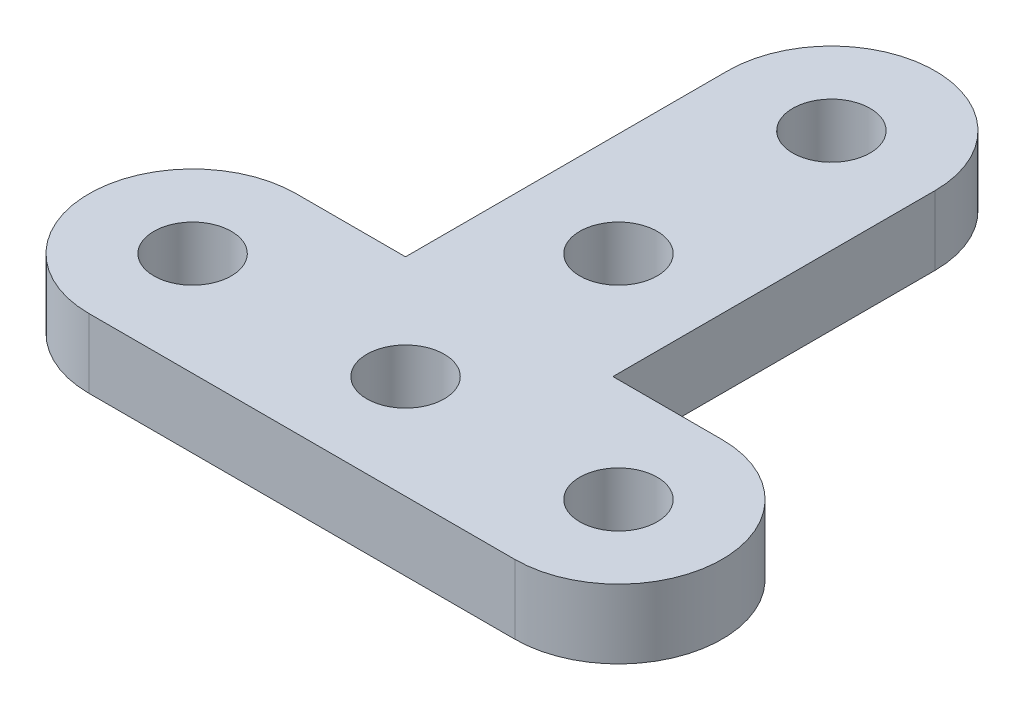
ISO-10303-21;
HEADER;
FILE_DESCRIPTION(('STEP AP214'),'2;1');
FILE_NAME('part.step','',(''),(''),'','','');
FILE_SCHEMA(('AUTOMOTIVE_DESIGN { 1 0 10303 214 1 1 1 1 }'));
ENDSEC;
DATA;
#1=APPLICATION_CONTEXT('core data for automotive mechanical design processes');
#2=APPLICATION_PROTOCOL_DEFINITION('international standard','automotive_design',2000,#1);
#3=PRODUCT_CONTEXT('',#1,'mechanical');
#4=PRODUCT('Part','Part','',(#3));
#5=PRODUCT_RELATED_PRODUCT_CATEGORY('part','',(#4));
#6=PRODUCT_DEFINITION_FORMATION('','',#4);
#7=PRODUCT_DEFINITION_CONTEXT('part definition',#1,'design');
#8=PRODUCT_DEFINITION('design','',#6,#7);
#9=PRODUCT_DEFINITION_SHAPE('','',#8);
#10=(LENGTH_UNIT() NAMED_UNIT(*) SI_UNIT(.MILLI.,.METRE.));
#11=(NAMED_UNIT(*) PLANE_ANGLE_UNIT() SI_UNIT($,.RADIAN.));
#12=(NAMED_UNIT(*) SI_UNIT($,.STERADIAN.) SOLID_ANGLE_UNIT());
#13=UNCERTAINTY_MEASURE_WITH_UNIT(LENGTH_MEASURE(1.E-05),#10,'distance_accuracy_value','');
#14=(GEOMETRIC_REPRESENTATION_CONTEXT(3) GLOBAL_UNCERTAINTY_ASSIGNED_CONTEXT((#13)) GLOBAL_UNIT_ASSIGNED_CONTEXT((#10,
#11,#12)) REPRESENTATION_CONTEXT('',''));
#15=CARTESIAN_POINT('',(0.,0.,0.));
#16=DIRECTION('',(0.,0.,1.));
#17=DIRECTION('',(1.,0.,0.));
#18=AXIS2_PLACEMENT_3D('',#15,#16,#17);
#19=CARTESIAN_POINT('',(9.779,0.,-4.7625));
#20=DIRECTION('',(0.,0.,-1.));
#21=DIRECTION('',(-1.,0.,0.));
#22=AXIS2_PLACEMENT_3D('',#19,#20,#21);
#23=PLANE('',#22);
#24=DIRECTION('',(-1.,0.,0.));
#25=VECTOR('',#24,1.);
#26=CARTESIAN_POINT('',(9.779,3.175,-4.7625));
#27=LINE('',#26,#25);
#28=CARTESIAN_POINT('',(9.779,3.175,-4.7625));
#29=VERTEX_POINT('',#28);
#30=CARTESIAN_POINT('',(4.7625,3.175,-4.7625));
#31=VERTEX_POINT('',#30);
#32=EDGE_CURVE('E129',#29,#31,#27,.T.);
#33=ORIENTED_EDGE('',*,*,#32,.F.);
#34=DIRECTION('',(0.,1.,0.));
#35=VECTOR('',#34,1.);
#36=CARTESIAN_POINT('',(9.779,0.,-4.7625));
#37=LINE('',#36,#35);
#38=CARTESIAN_POINT('',(9.779,0.,-4.7625));
#39=VERTEX_POINT('',#38);
#40=EDGE_CURVE('E11',#39,#29,#37,.T.);
#41=ORIENTED_EDGE('',*,*,#40,.F.);
#42=DIRECTION('',(-1.,0.,0.));
#43=VECTOR('',#42,1.);
#44=CARTESIAN_POINT('',(9.779,0.,-4.7625));
#45=LINE('',#44,#43);
#46=CARTESIAN_POINT('',(4.7625,0.,-4.7625));
#47=VERTEX_POINT('',#46);
#48=EDGE_CURVE('E150',#39,#47,#45,.T.);
#49=ORIENTED_EDGE('',*,*,#48,.T.);
#50=DIRECTION('',(0.,1.,0.));
#51=VECTOR('',#50,1.);
#52=CARTESIAN_POINT('',(4.7625,0.,-4.7625));
#53=LINE('',#52,#51);
#54=EDGE_CURVE('E35',#47,#31,#53,.T.);
#55=ORIENTED_EDGE('',*,*,#54,.T.);
#56=EDGE_LOOP('',(#33,#41,#49,#55));
#57=FACE_BOUND('',#56,.T.);
#58=ADVANCED_FACE('F32',(#57),#23,.T.);
#59=CARTESIAN_POINT('',(9.779,0.,0.));
#60=DIRECTION('',(0.,1.,0.));
#61=DIRECTION('',(0.,0.,1.));
#62=AXIS2_PLACEMENT_3D('',#59,#60,#61);
#63=CYLINDRICAL_SURFACE('',#62,4.7625);
#64=CARTESIAN_POINT('',(9.779,3.175,0.));
#65=DIRECTION('',(0.,1.,0.));
#66=DIRECTION('',(0.,0.,1.));
#67=AXIS2_PLACEMENT_3D('',#64,#65,#66);
#68=CIRCLE('',#67,4.7625);
#69=CARTESIAN_POINT('',(9.779,3.175,4.7625));
#70=VERTEX_POINT('',#69);
#71=EDGE_CURVE('E148',#70,#29,#68,.T.);
#72=ORIENTED_EDGE('',*,*,#71,.F.);
#73=DIRECTION('',(0.,1.,0.));
#74=VECTOR('',#73,1.);
#75=CARTESIAN_POINT('',(9.779,0.,4.7625));
#76=LINE('',#75,#74);
#77=CARTESIAN_POINT('',(9.779,0.,4.7625));
#78=VERTEX_POINT('',#77);
#79=EDGE_CURVE('E41',#78,#70,#76,.T.);
#80=ORIENTED_EDGE('',*,*,#79,.F.);
#81=CARTESIAN_POINT('',(9.779,0.,0.));
#82=DIRECTION('',(0.,1.,0.));
#83=DIRECTION('',(0.,0.,1.));
#84=AXIS2_PLACEMENT_3D('',#81,#82,#83);
#85=CIRCLE('',#84,4.7625);
#86=EDGE_CURVE('E119',#78,#39,#85,.T.);
#87=ORIENTED_EDGE('',*,*,#86,.T.);
#88=ORIENTED_EDGE('',*,*,#40,.T.);
#89=EDGE_LOOP('',(#72,#80,#87,#88));
#90=FACE_BOUND('',#89,.T.);
#91=ADVANCED_FACE('F162',(#90),#63,.T.);
#92=CARTESIAN_POINT('',(-9.779,0.,4.7625));
#93=DIRECTION('',(0.,0.,1.));
#94=DIRECTION('',(1.,0.,0.));
#95=AXIS2_PLACEMENT_3D('',#92,#93,#94);
#96=PLANE('',#95);
#97=DIRECTION('',(1.,0.,0.));
#98=VECTOR('',#97,1.);
#99=CARTESIAN_POINT('',(-9.779,3.175,4.7625));
#100=LINE('',#99,#98);
#101=CARTESIAN_POINT('',(-9.779,3.175,4.7625));
#102=VERTEX_POINT('',#101);
#103=EDGE_CURVE('E106',#102,#70,#100,.T.);
#104=ORIENTED_EDGE('',*,*,#103,.F.);
#105=DIRECTION('',(0.,1.,0.));
#106=VECTOR('',#105,1.);
#107=CARTESIAN_POINT('',(-9.779,0.,4.7625));
#108=LINE('',#107,#106);
#109=CARTESIAN_POINT('',(-9.779,0.,4.7625));
#110=VERTEX_POINT('',#109);
#111=EDGE_CURVE('E101',#110,#102,#108,.T.);
#112=ORIENTED_EDGE('',*,*,#111,.F.);
#113=DIRECTION('',(1.,0.,0.));
#114=VECTOR('',#113,1.);
#115=CARTESIAN_POINT('',(-9.779,0.,4.7625));
#116=LINE('',#115,#114);
#117=EDGE_CURVE('E104',#110,#78,#116,.T.);
#118=ORIENTED_EDGE('',*,*,#117,.T.);
#119=ORIENTED_EDGE('',*,*,#79,.T.);
#120=EDGE_LOOP('',(#104,#112,#118,#119));
#121=FACE_BOUND('',#120,.T.);
#122=ADVANCED_FACE('F103',(#121),#96,.T.);
#123=CARTESIAN_POINT('',(-9.779,0.,0.));
#124=DIRECTION('',(0.,1.,0.));
#125=DIRECTION('',(0.,0.,1.));
#126=AXIS2_PLACEMENT_3D('',#123,#124,#125);
#127=CYLINDRICAL_SURFACE('',#126,4.7625);
#128=CARTESIAN_POINT('',(-9.779,3.175,0.));
#129=DIRECTION('',(0.,1.,0.));
#130=DIRECTION('',(0.,0.,1.));
#131=AXIS2_PLACEMENT_3D('',#128,#129,#130);
#132=CIRCLE('',#131,4.7625);
#133=CARTESIAN_POINT('',(-9.779,3.175,-4.7625));
#134=VERTEX_POINT('',#133);
#135=EDGE_CURVE('E145',#134,#102,#132,.T.);
#136=ORIENTED_EDGE('',*,*,#135,.F.);
#137=DIRECTION('',(0.,1.,0.));
#138=VECTOR('',#137,1.);
#139=CARTESIAN_POINT('',(-9.779,0.,-4.7625));
#140=LINE('',#139,#138);
#141=CARTESIAN_POINT('',(-9.779,0.,-4.7625));
#142=VERTEX_POINT('',#141);
#143=EDGE_CURVE('E111',#142,#134,#140,.T.);
#144=ORIENTED_EDGE('',*,*,#143,.F.);
#145=CARTESIAN_POINT('',(-9.779,0.,0.));
#146=DIRECTION('',(0.,1.,0.));
#147=DIRECTION('',(0.,0.,1.));
#148=AXIS2_PLACEMENT_3D('',#145,#146,#147);
#149=CIRCLE('',#148,4.7625);
#150=EDGE_CURVE('E117',#142,#110,#149,.T.);
#151=ORIENTED_EDGE('',*,*,#150,.T.);
#152=ORIENTED_EDGE('',*,*,#111,.T.);
#153=EDGE_LOOP('',(#136,#144,#151,#152));
#154=FACE_BOUND('',#153,.T.);
#155=ADVANCED_FACE('F121',(#154),#127,.T.);
#156=CARTESIAN_POINT('',(-4.7625,0.,-4.7625));
#157=DIRECTION('',(0.,0.,-1.));
#158=DIRECTION('',(-1.,0.,0.));
#159=AXIS2_PLACEMENT_3D('',#156,#157,#158);
#160=PLANE('',#159);
#161=DIRECTION('',(-1.,0.,0.));
#162=VECTOR('',#161,1.);
#163=CARTESIAN_POINT('',(-4.7625,3.175,-4.7625));
#164=LINE('',#163,#162);
#165=CARTESIAN_POINT('',(-4.7625,3.175,-4.7625));
#166=VERTEX_POINT('',#165);
#167=EDGE_CURVE('E142',#166,#134,#164,.T.);
#168=ORIENTED_EDGE('',*,*,#167,.F.);
#169=DIRECTION('',(0.,1.,0.));
#170=VECTOR('',#169,1.);
#171=CARTESIAN_POINT('',(-4.7625,0.,-4.7625));
#172=LINE('',#171,#170);
#173=CARTESIAN_POINT('',(-4.7625,0.,-4.7625));
#174=VERTEX_POINT('',#173);
#175=EDGE_CURVE('E154',#174,#166,#172,.T.);
#176=ORIENTED_EDGE('',*,*,#175,.F.);
#177=DIRECTION('',(-1.,0.,0.));
#178=VECTOR('',#177,1.);
#179=CARTESIAN_POINT('',(-4.7625,0.,-4.7625));
#180=LINE('',#179,#178);
#181=EDGE_CURVE('E122',#174,#142,#180,.T.);
#182=ORIENTED_EDGE('',*,*,#181,.T.);
#183=ORIENTED_EDGE('',*,*,#143,.T.);
#184=EDGE_LOOP('',(#168,#176,#182,#183));
#185=FACE_BOUND('',#184,.T.);
#186=ADVANCED_FACE('F175',(#185),#160,.T.);
#187=CARTESIAN_POINT('',(-4.7625,0.,-19.558));
#188=DIRECTION('',(-1.,0.,0.));
#189=DIRECTION('',(0.,0.,1.));
#190=AXIS2_PLACEMENT_3D('',#187,#188,#189);
#191=PLANE('',#190);
#192=DIRECTION('',(0.,0.,1.));
#193=VECTOR('',#192,1.);
#194=CARTESIAN_POINT('',(-4.7625,3.175,-19.558));
#195=LINE('',#194,#193);
#196=CARTESIAN_POINT('',(-4.7625,3.175,-19.558));
#197=VERTEX_POINT('',#196);
#198=EDGE_CURVE('E139',#197,#166,#195,.T.);
#199=ORIENTED_EDGE('',*,*,#198,.F.);
#200=DIRECTION('',(0.,1.,0.));
#201=VECTOR('',#200,1.);
#202=CARTESIAN_POINT('',(-4.7625,0.,-19.558));
#203=LINE('',#202,#201);
#204=CARTESIAN_POINT('',(-4.7625,0.,-19.558));
#205=VERTEX_POINT('',#204);
#206=EDGE_CURVE('E156',#205,#197,#203,.T.);
#207=ORIENTED_EDGE('',*,*,#206,.F.);
#208=DIRECTION('',(0.,0.,1.));
#209=VECTOR('',#208,1.);
#210=CARTESIAN_POINT('',(-4.7625,0.,-19.558));
#211=LINE('',#210,#209);
#212=EDGE_CURVE('E124',#205,#174,#211,.T.);
#213=ORIENTED_EDGE('',*,*,#212,.T.);
#214=ORIENTED_EDGE('',*,*,#175,.T.);
#215=EDGE_LOOP('',(#199,#207,#213,#214));
#216=FACE_BOUND('',#215,.T.);
#217=ADVANCED_FACE('F178',(#216),#191,.T.);
#218=CARTESIAN_POINT('',(0.,0.,-19.558));
#219=DIRECTION('',(0.,1.,0.));
#220=DIRECTION('',(0.,0.,1.));
#221=AXIS2_PLACEMENT_3D('',#218,#219,#220);
#222=CYLINDRICAL_SURFACE('',#221,4.7625);
#223=CARTESIAN_POINT('',(0.,3.175,-19.558));
#224=DIRECTION('',(0.,1.,0.));
#225=DIRECTION('',(0.,0.,1.));
#226=AXIS2_PLACEMENT_3D('',#223,#224,#225);
#227=CIRCLE('',#226,4.7625);
#228=CARTESIAN_POINT('',(4.7625,3.175,-19.558));
#229=VERTEX_POINT('',#228);
#230=EDGE_CURVE('E136',#229,#197,#227,.T.);
#231=ORIENTED_EDGE('',*,*,#230,.F.);
#232=DIRECTION('',(0.,1.,0.));
#233=VECTOR('',#232,1.);
#234=CARTESIAN_POINT('',(4.7625,0.,-19.558));
#235=LINE('',#234,#233);
#236=CARTESIAN_POINT('',(4.7625,0.,-19.558));
#237=VERTEX_POINT('',#236);
#238=EDGE_CURVE('E157',#237,#229,#235,.T.);
#239=ORIENTED_EDGE('',*,*,#238,.F.);
#240=CARTESIAN_POINT('',(0.,0.,-19.558));
#241=DIRECTION('',(0.,1.,0.));
#242=DIRECTION('',(0.,0.,1.));
#243=AXIS2_PLACEMENT_3D('',#240,#241,#242);
#244=CIRCLE('',#243,4.7625);
#245=EDGE_CURVE('E254',#237,#205,#244,.T.);
#246=ORIENTED_EDGE('',*,*,#245,.T.);
#247=ORIENTED_EDGE('',*,*,#206,.T.);
#248=EDGE_LOOP('',(#231,#239,#246,#247));
#249=FACE_BOUND('',#248,.T.);
#250=ADVANCED_FACE('F182',(#249),#222,.T.);
#251=CARTESIAN_POINT('',(4.7625,0.,-4.7625));
#252=DIRECTION('',(1.,0.,0.));
#253=DIRECTION('',(0.,0.,-1.));
#254=AXIS2_PLACEMENT_3D('',#251,#252,#253);
#255=PLANE('',#254);
#256=DIRECTION('',(0.,0.,-1.));
#257=VECTOR('',#256,1.);
#258=CARTESIAN_POINT('',(4.7625,3.175,-4.7625));
#259=LINE('',#258,#257);
#260=EDGE_CURVE('E132',#31,#229,#259,.T.);
#261=ORIENTED_EDGE('',*,*,#260,.F.);
#262=ORIENTED_EDGE('',*,*,#54,.F.);
#263=DIRECTION('',(0.,0.,-1.));
#264=VECTOR('',#263,1.);
#265=CARTESIAN_POINT('',(4.7625,0.,-4.7625));
#266=LINE('',#265,#264);
#267=EDGE_CURVE('E252',#47,#237,#266,.T.);
#268=ORIENTED_EDGE('',*,*,#267,.T.);
#269=ORIENTED_EDGE('',*,*,#238,.T.);
#270=EDGE_LOOP('',(#261,#262,#268,#269));
#271=FACE_BOUND('',#270,.T.);
#272=ADVANCED_FACE('F159',(#271),#255,.T.);
#273=CARTESIAN_POINT('',(0.,0.,-19.558));
#274=DIRECTION('',(0.,1.,0.));
#275=DIRECTION('',(0.,0.,1.));
#276=AXIS2_PLACEMENT_3D('',#273,#274,#275);
#277=PLANE('',#276);
#278=CARTESIAN_POINT('',(0.,0.,0.));
#279=DIRECTION('',(0.,1.,0.));
#280=DIRECTION('',(0.,0.,-1.));
#281=AXIS2_PLACEMENT_3D('',#278,#279,#280);
#282=CIRCLE('',#281,1.77799999999999);
#283=CARTESIAN_POINT('',(0.,0.,1.77799999999999));
#284=VERTEX_POINT('',#283);
#285=EDGE_CURVE('E221',#284,#284,#282,.T.);
#286=ORIENTED_EDGE('',*,*,#285,.T.);
#287=EDGE_LOOP('',(#286));
#288=FACE_BOUND('',#287,.T.);
#289=CARTESIAN_POINT('',(-9.779,0.,0.));
#290=DIRECTION('',(0.,1.,0.));
#291=DIRECTION('',(0.,0.,-1.));
#292=AXIS2_PLACEMENT_3D('',#289,#290,#291);
#293=CIRCLE('',#292,1.77799999999999);
#294=CARTESIAN_POINT('',(-9.779,0.,1.77799999999999));
#295=VERTEX_POINT('',#294);
#296=EDGE_CURVE('E229',#295,#295,#293,.T.);
#297=ORIENTED_EDGE('',*,*,#296,.T.);
#298=EDGE_LOOP('',(#297));
#299=FACE_BOUND('',#298,.T.);
#300=CARTESIAN_POINT('',(0.,0.,-9.77899999999998));
#301=DIRECTION('',(0.,1.,0.));
#302=DIRECTION('',(0.,0.,-1.));
#303=AXIS2_PLACEMENT_3D('',#300,#301,#302);
#304=CIRCLE('',#303,1.77799999999999);
#305=CARTESIAN_POINT('',(0.,0.,-8.00099999999999));
#306=VERTEX_POINT('',#305);
#307=EDGE_CURVE('E235',#306,#306,#304,.T.);
#308=ORIENTED_EDGE('',*,*,#307,.T.);
#309=EDGE_LOOP('',(#308));
#310=FACE_BOUND('',#309,.T.);
#311=CARTESIAN_POINT('',(9.779,0.,0.));
#312=DIRECTION('',(0.,1.,0.));
#313=DIRECTION('',(0.,0.,-1.));
#314=AXIS2_PLACEMENT_3D('',#311,#312,#313);
#315=CIRCLE('',#314,1.77799999999999);
#316=CARTESIAN_POINT('',(9.779,0.,1.77799999999999));
#317=VERTEX_POINT('',#316);
#318=EDGE_CURVE('E241',#317,#317,#315,.T.);
#319=ORIENTED_EDGE('',*,*,#318,.T.);
#320=EDGE_LOOP('',(#319));
#321=FACE_BOUND('',#320,.T.);
#322=CARTESIAN_POINT('',(0.,0.,-19.558));
#323=DIRECTION('',(0.,1.,0.));
#324=DIRECTION('',(0.,0.,-1.));
#325=AXIS2_PLACEMENT_3D('',#322,#323,#324);
#326=CIRCLE('',#325,1.77799999999999);
#327=CARTESIAN_POINT('',(0.,0.,-17.78));
#328=VERTEX_POINT('',#327);
#329=EDGE_CURVE('E133',#328,#328,#326,.T.);
#330=ORIENTED_EDGE('',*,*,#329,.T.);
#331=EDGE_LOOP('',(#330));
#332=FACE_BOUND('',#331,.T.);
#333=ORIENTED_EDGE('',*,*,#48,.F.);
#334=ORIENTED_EDGE('',*,*,#86,.F.);
#335=ORIENTED_EDGE('',*,*,#117,.F.);
#336=ORIENTED_EDGE('',*,*,#150,.F.);
#337=ORIENTED_EDGE('',*,*,#181,.F.);
#338=ORIENTED_EDGE('',*,*,#212,.F.);
#339=ORIENTED_EDGE('',*,*,#245,.F.);
#340=ORIENTED_EDGE('',*,*,#267,.F.);
#341=EDGE_LOOP('',(#333,#334,#335,#336,#337,#338,#339,#340));
#342=FACE_BOUND('',#341,.T.);
#343=ADVANCED_FACE('F115',(#288,#299,#310,#321,#332,#342),#277,.F.);
#344=CARTESIAN_POINT('',(0.,3.175,-19.558));
#345=DIRECTION('',(0.,1.,0.));
#346=DIRECTION('',(0.,0.,1.));
#347=AXIS2_PLACEMENT_3D('',#344,#345,#346);
#348=PLANE('',#347);
#349=CARTESIAN_POINT('',(0.,3.175,0.));
#350=DIRECTION('',(0.,1.,0.));
#351=DIRECTION('',(0.,0.,-1.));
#352=AXIS2_PLACEMENT_3D('',#349,#350,#351);
#353=CIRCLE('',#352,1.77799999999999);
#354=CARTESIAN_POINT('',(0.,3.175,1.77799999999999));
#355=VERTEX_POINT('',#354);
#356=EDGE_CURVE('E224',#355,#355,#353,.T.);
#357=ORIENTED_EDGE('',*,*,#356,.F.);
#358=EDGE_LOOP('',(#357));
#359=FACE_BOUND('',#358,.T.);
#360=CARTESIAN_POINT('',(-9.779,3.175,0.));
#361=DIRECTION('',(0.,1.,0.));
#362=DIRECTION('',(0.,0.,-1.));
#363=AXIS2_PLACEMENT_3D('',#360,#361,#362);
#364=CIRCLE('',#363,1.77799999999999);
#365=CARTESIAN_POINT('',(-9.779,3.175,1.77799999999999));
#366=VERTEX_POINT('',#365);
#367=EDGE_CURVE('E226',#366,#366,#364,.T.);
#368=ORIENTED_EDGE('',*,*,#367,.F.);
#369=EDGE_LOOP('',(#368));
#370=FACE_BOUND('',#369,.T.);
#371=CARTESIAN_POINT('',(0.,3.175,-9.77899999999998));
#372=DIRECTION('',(0.,1.,0.));
#373=DIRECTION('',(0.,0.,-1.));
#374=AXIS2_PLACEMENT_3D('',#371,#372,#373);
#375=CIRCLE('',#374,1.77799999999999);
#376=CARTESIAN_POINT('',(0.,3.175,-8.00099999999999));
#377=VERTEX_POINT('',#376);
#378=EDGE_CURVE('E232',#377,#377,#375,.T.);
#379=ORIENTED_EDGE('',*,*,#378,.F.);
#380=EDGE_LOOP('',(#379));
#381=FACE_BOUND('',#380,.T.);
#382=CARTESIAN_POINT('',(9.779,3.175,0.));
#383=DIRECTION('',(0.,1.,0.));
#384=DIRECTION('',(0.,0.,-1.));
#385=AXIS2_PLACEMENT_3D('',#382,#383,#384);
#386=CIRCLE('',#385,1.77799999999999);
#387=CARTESIAN_POINT('',(9.779,3.175,1.77799999999999));
#388=VERTEX_POINT('',#387);
#389=EDGE_CURVE('E238',#388,#388,#386,.T.);
#390=ORIENTED_EDGE('',*,*,#389,.F.);
#391=EDGE_LOOP('',(#390));
#392=FACE_BOUND('',#391,.T.);
#393=CARTESIAN_POINT('',(0.,3.175,-19.558));
#394=DIRECTION('',(0.,1.,0.));
#395=DIRECTION('',(0.,0.,-1.));
#396=AXIS2_PLACEMENT_3D('',#393,#394,#395);
#397=CIRCLE('',#396,1.77799999999999);
#398=CARTESIAN_POINT('',(0.,3.175,-17.78));
#399=VERTEX_POINT('',#398);
#400=EDGE_CURVE('E244',#399,#399,#397,.T.);
#401=ORIENTED_EDGE('',*,*,#400,.F.);
#402=EDGE_LOOP('',(#401));
#403=FACE_BOUND('',#402,.T.);
#404=ORIENTED_EDGE('',*,*,#32,.T.);
#405=ORIENTED_EDGE('',*,*,#260,.T.);
#406=ORIENTED_EDGE('',*,*,#230,.T.);
#407=ORIENTED_EDGE('',*,*,#198,.T.);
#408=ORIENTED_EDGE('',*,*,#167,.T.);
#409=ORIENTED_EDGE('',*,*,#135,.T.);
#410=ORIENTED_EDGE('',*,*,#103,.T.);
#411=ORIENTED_EDGE('',*,*,#71,.T.);
#412=EDGE_LOOP('',(#404,#405,#406,#407,#408,#409,#410,#411));
#413=FACE_BOUND('',#412,.T.);
#414=ADVANCED_FACE('F161',(#359,#370,#381,#392,#403,#413),#348,.T.);
#415=CARTESIAN_POINT('',(0.,0.,-19.558));
#416=DIRECTION('',(0.,1.,0.));
#417=DIRECTION('',(0.,0.,1.));
#418=AXIS2_PLACEMENT_3D('',#415,#416,#417);
#419=CYLINDRICAL_SURFACE('',#418,1.77799999999999);
#420=CARTESIAN_POINT('',(0.,0.,-17.78));
#421=CARTESIAN_POINT('',(0.,0.0330729166666679,-17.78));
#422=CARTESIAN_POINT('',(0.,0.0661458333333346,-17.78));
#423=CARTESIAN_POINT('',(0.,0.132291666666668,-17.78));
#424=CARTESIAN_POINT('',(0.,0.165364583333335,-17.78));
#425=CARTESIAN_POINT('',(0.,0.231510416666668,-17.78));
#426=CARTESIAN_POINT('',(0.,0.264583333333335,-17.78));
#427=CARTESIAN_POINT('',(0.,0.330729166666668,-17.78));
#428=CARTESIAN_POINT('',(0.,0.363802083333334,-17.78));
#429=CARTESIAN_POINT('',(0.,0.429947916666668,-17.78));
#430=CARTESIAN_POINT('',(0.,0.463020833333334,-17.78));
#431=CARTESIAN_POINT('',(0.,0.529166666666668,-17.78));
#432=CARTESIAN_POINT('',(0.,0.562239583333334,-17.78));
#433=CARTESIAN_POINT('',(0.,0.628385416666668,-17.78));
#434=CARTESIAN_POINT('',(0.,0.661458333333334,-17.78));
#435=CARTESIAN_POINT('',(0.,0.727604166666668,-17.78));
#436=CARTESIAN_POINT('',(0.,0.760677083333334,-17.78));
#437=CARTESIAN_POINT('',(0.,0.826822916666668,-17.78));
#438=CARTESIAN_POINT('',(0.,0.859895833333334,-17.78));
#439=CARTESIAN_POINT('',(0.,0.926041666666667,-17.78));
#440=CARTESIAN_POINT('',(0.,0.959114583333334,-17.78));
#441=CARTESIAN_POINT('',(0.,1.02526041666667,-17.78));
#442=CARTESIAN_POINT('',(0.,1.05833333333333,-17.78));
#443=CARTESIAN_POINT('',(0.,1.12447916666667,-17.78));
#444=CARTESIAN_POINT('',(0.,1.15755208333333,-17.78));
#445=CARTESIAN_POINT('',(0.,1.22369791666667,-17.78));
#446=CARTESIAN_POINT('',(0.,1.25677083333333,-17.78));
#447=CARTESIAN_POINT('',(0.,1.32291666666667,-17.78));
#448=CARTESIAN_POINT('',(0.,1.35598958333333,-17.78));
#449=CARTESIAN_POINT('',(0.,1.42213541666667,-17.78));
#450=CARTESIAN_POINT('',(0.,1.45520833333333,-17.78));
#451=CARTESIAN_POINT('',(0.,1.52135416666667,-17.78));
#452=CARTESIAN_POINT('',(0.,1.55442708333333,-17.78));
#453=CARTESIAN_POINT('',(0.,1.62057291666667,-17.78));
#454=CARTESIAN_POINT('',(0.,1.65364583333333,-17.78));
#455=CARTESIAN_POINT('',(0.,1.71979166666667,-17.78));
#456=CARTESIAN_POINT('',(0.,1.75286458333333,-17.78));
#457=CARTESIAN_POINT('',(0.,1.81901041666667,-17.78));
#458=CARTESIAN_POINT('',(0.,1.85208333333333,-17.78));
#459=CARTESIAN_POINT('',(0.,1.91822916666667,-17.78));
#460=CARTESIAN_POINT('',(0.,1.95130208333333,-17.78));
#461=CARTESIAN_POINT('',(0.,2.01744791666667,-17.78));
#462=CARTESIAN_POINT('',(0.,2.05052083333333,-17.78));
#463=CARTESIAN_POINT('',(0.,2.11666666666667,-17.78));
#464=CARTESIAN_POINT('',(0.,2.14973958333333,-17.78));
#465=CARTESIAN_POINT('',(0.,2.21588541666667,-17.78));
#466=CARTESIAN_POINT('',(0.,2.24895833333333,-17.78));
#467=CARTESIAN_POINT('',(0.,2.31510416666667,-17.78));
#468=CARTESIAN_POINT('',(0.,2.34817708333333,-17.78));
#469=CARTESIAN_POINT('',(0.,2.41432291666667,-17.78));
#470=CARTESIAN_POINT('',(0.,2.44739583333333,-17.78));
#471=CARTESIAN_POINT('',(0.,2.51354166666667,-17.78));
#472=CARTESIAN_POINT('',(0.,2.54661458333333,-17.78));
#473=CARTESIAN_POINT('',(0.,2.61276041666667,-17.78));
#474=CARTESIAN_POINT('',(0.,2.64583333333333,-17.78));
#475=CARTESIAN_POINT('',(0.,2.71197916666667,-17.78));
#476=CARTESIAN_POINT('',(0.,2.74505208333333,-17.78));
#477=CARTESIAN_POINT('',(0.,2.81119791666667,-17.78));
#478=CARTESIAN_POINT('',(0.,2.84427083333333,-17.78));
#479=CARTESIAN_POINT('',(0.,2.91041666666667,-17.78));
#480=CARTESIAN_POINT('',(0.,2.94348958333333,-17.78));
#481=CARTESIAN_POINT('',(0.,3.00963541666667,-17.78));
#482=CARTESIAN_POINT('',(0.,3.04270833333333,-17.78));
#483=CARTESIAN_POINT('',(0.,3.10885416666667,-17.78));
#484=CARTESIAN_POINT('',(0.,3.14192708333333,-17.78));
#485=CARTESIAN_POINT('',(0.,3.175,-17.78));
#486=B_SPLINE_CURVE_WITH_KNOTS('',3,(#420,#421,#422,#423,#424,#425,#426,#427,#428,#429,#430,
#431,#432,#433,#434,#435,#436,#437,#438,#439,#440,#441,#442,#443,#444,#445,#446,#447,#448,#449,
#450,#451,#452,#453,#454,#455,#456,#457,#458,#459,#460,#461,#462,#463,#464,#465,#466,#467,#468,
#469,#470,#471,#472,#473,#474,#475,#476,#477,#478,#479,#480,#481,#482,#483,#484,#485),
.UNSPECIFIED.,.F.,.F.,(4,2,2,2,2,2,2,2,2,2,2,2,2,2,2,2,2,2,2,2,2,2,2,2,2,2,2,2,2,2,2,2,4),(0.,
0.09921875,0.1984375,0.29765625,0.396875,0.49609375,0.5953125,0.69453125,0.79375,0.89296875,
0.992187499999999,1.09140625,1.190625,1.28984375,1.3890625,1.48828125,1.5875,1.68671875,
1.7859375,1.88515625,1.984375,2.08359375,2.1828125,2.28203125,2.38125,2.48046875,2.5796875,
2.67890625,2.778125,2.87734375,2.9765625,3.07578125,3.175),.UNSPECIFIED.);
#487=EDGE_CURVE('BSEAM194',#328,#399,#486,.T.);
#488=ORIENTED_EDGE('',*,*,#329,.F.);
#489=ORIENTED_EDGE('',*,*,#400,.T.);
#490=ORIENTED_EDGE('',*,*,#487,.T.);
#491=ORIENTED_EDGE('',*,*,#487,.F.);
#492=EDGE_LOOP('',(#488,#490,#489,#491));
#493=FACE_BOUND('',#492,.T.);
#494=ADVANCED_FACE('F194',(#493),#419,.F.);
#495=CARTESIAN_POINT('',(9.779,0.,0.));
#496=DIRECTION('',(0.,1.,0.));
#497=DIRECTION('',(0.,0.,1.));
#498=AXIS2_PLACEMENT_3D('',#495,#496,#497);
#499=CYLINDRICAL_SURFACE('',#498,1.77799999999999);
#500=CARTESIAN_POINT('',(9.779,0.,1.77799999999999));
#501=CARTESIAN_POINT('',(9.779,0.0330729166666679,1.77799999999999));
#502=CARTESIAN_POINT('',(9.779,0.0661458333333346,1.77799999999999));
#503=CARTESIAN_POINT('',(9.779,0.132291666666668,1.77799999999999));
#504=CARTESIAN_POINT('',(9.779,0.165364583333335,1.77799999999999));
#505=CARTESIAN_POINT('',(9.779,0.231510416666668,1.77799999999999));
#506=CARTESIAN_POINT('',(9.779,0.264583333333335,1.77799999999999));
#507=CARTESIAN_POINT('',(9.779,0.330729166666668,1.77799999999999));
#508=CARTESIAN_POINT('',(9.779,0.363802083333334,1.77799999999999));
#509=CARTESIAN_POINT('',(9.779,0.429947916666668,1.77799999999999));
#510=CARTESIAN_POINT('',(9.779,0.463020833333334,1.77799999999999));
#511=CARTESIAN_POINT('',(9.779,0.529166666666668,1.77799999999999));
#512=CARTESIAN_POINT('',(9.779,0.562239583333334,1.77799999999999));
#513=CARTESIAN_POINT('',(9.779,0.628385416666668,1.77799999999999));
#514=CARTESIAN_POINT('',(9.779,0.661458333333334,1.77799999999999));
#515=CARTESIAN_POINT('',(9.779,0.727604166666668,1.77799999999999));
#516=CARTESIAN_POINT('',(9.779,0.760677083333334,1.77799999999999));
#517=CARTESIAN_POINT('',(9.779,0.826822916666668,1.77799999999999));
#518=CARTESIAN_POINT('',(9.779,0.859895833333334,1.77799999999999));
#519=CARTESIAN_POINT('',(9.779,0.926041666666667,1.77799999999999));
#520=CARTESIAN_POINT('',(9.779,0.959114583333334,1.77799999999999));
#521=CARTESIAN_POINT('',(9.779,1.02526041666667,1.77799999999999));
#522=CARTESIAN_POINT('',(9.779,1.05833333333333,1.77799999999999));
#523=CARTESIAN_POINT('',(9.779,1.12447916666667,1.77799999999999));
#524=CARTESIAN_POINT('',(9.779,1.15755208333333,1.77799999999999));
#525=CARTESIAN_POINT('',(9.779,1.22369791666667,1.77799999999999));
#526=CARTESIAN_POINT('',(9.779,1.25677083333333,1.77799999999999));
#527=CARTESIAN_POINT('',(9.779,1.32291666666667,1.77799999999999));
#528=CARTESIAN_POINT('',(9.779,1.35598958333333,1.77799999999999));
#529=CARTESIAN_POINT('',(9.779,1.42213541666667,1.77799999999999));
#530=CARTESIAN_POINT('',(9.779,1.45520833333333,1.77799999999999));
#531=CARTESIAN_POINT('',(9.779,1.52135416666667,1.77799999999999));
#532=CARTESIAN_POINT('',(9.779,1.55442708333333,1.77799999999999));
#533=CARTESIAN_POINT('',(9.779,1.62057291666667,1.77799999999999));
#534=CARTESIAN_POINT('',(9.779,1.65364583333333,1.77799999999999));
#535=CARTESIAN_POINT('',(9.779,1.71979166666667,1.77799999999999));
#536=CARTESIAN_POINT('',(9.779,1.75286458333333,1.77799999999999));
#537=CARTESIAN_POINT('',(9.779,1.81901041666667,1.77799999999999));
#538=CARTESIAN_POINT('',(9.779,1.85208333333333,1.77799999999999));
#539=CARTESIAN_POINT('',(9.779,1.91822916666667,1.77799999999999));
#540=CARTESIAN_POINT('',(9.779,1.95130208333333,1.77799999999999));
#541=CARTESIAN_POINT('',(9.779,2.01744791666667,1.77799999999999));
#542=CARTESIAN_POINT('',(9.779,2.05052083333333,1.77799999999999));
#543=CARTESIAN_POINT('',(9.779,2.11666666666667,1.77799999999999));
#544=CARTESIAN_POINT('',(9.779,2.14973958333333,1.77799999999999));
#545=CARTESIAN_POINT('',(9.779,2.21588541666667,1.77799999999999));
#546=CARTESIAN_POINT('',(9.779,2.24895833333333,1.77799999999999));
#547=CARTESIAN_POINT('',(9.779,2.31510416666667,1.77799999999999));
#548=CARTESIAN_POINT('',(9.779,2.34817708333333,1.77799999999999));
#549=CARTESIAN_POINT('',(9.779,2.41432291666667,1.77799999999999));
#550=CARTESIAN_POINT('',(9.779,2.44739583333333,1.77799999999999));
#551=CARTESIAN_POINT('',(9.779,2.51354166666667,1.77799999999999));
#552=CARTESIAN_POINT('',(9.779,2.54661458333333,1.77799999999999));
#553=CARTESIAN_POINT('',(9.779,2.61276041666667,1.77799999999999));
#554=CARTESIAN_POINT('',(9.779,2.64583333333333,1.77799999999999));
#555=CARTESIAN_POINT('',(9.779,2.71197916666667,1.77799999999999));
#556=CARTESIAN_POINT('',(9.779,2.74505208333333,1.77799999999999));
#557=CARTESIAN_POINT('',(9.779,2.81119791666667,1.77799999999999));
#558=CARTESIAN_POINT('',(9.779,2.84427083333333,1.77799999999999));
#559=CARTESIAN_POINT('',(9.779,2.91041666666667,1.77799999999999));
#560=CARTESIAN_POINT('',(9.779,2.94348958333333,1.77799999999999));
#561=CARTESIAN_POINT('',(9.779,3.00963541666667,1.77799999999999));
#562=CARTESIAN_POINT('',(9.779,3.04270833333333,1.77799999999999));
#563=CARTESIAN_POINT('',(9.779,3.10885416666667,1.77799999999999));
#564=CARTESIAN_POINT('',(9.779,3.14192708333333,1.77799999999999));
#565=CARTESIAN_POINT('',(9.779,3.175,1.77799999999999));
#566=B_SPLINE_CURVE_WITH_KNOTS('',3,(#500,#501,#502,#503,#504,#505,#506,#507,#508,#509,#510,
#511,#512,#513,#514,#515,#516,#517,#518,#519,#520,#521,#522,#523,#524,#525,#526,#527,#528,#529,
#530,#531,#532,#533,#534,#535,#536,#537,#538,#539,#540,#541,#542,#543,#544,#545,#546,#547,#548,
#549,#550,#551,#552,#553,#554,#555,#556,#557,#558,#559,#560,#561,#562,#563,#564,#565),
.UNSPECIFIED.,.F.,.F.,(4,2,2,2,2,2,2,2,2,2,2,2,2,2,2,2,2,2,2,2,2,2,2,2,2,2,2,2,2,2,2,2,4),(0.,
0.09921875,0.1984375,0.29765625,0.396875,0.49609375,0.5953125,0.69453125,0.79375,0.89296875,
0.992187499999999,1.09140625,1.190625,1.28984375,1.3890625,1.48828125,1.5875,1.68671875,
1.7859375,1.88515625,1.984375,2.08359375,2.1828125,2.28203125,2.38125,2.48046875,2.5796875,
2.67890625,2.778125,2.87734375,2.9765625,3.07578125,3.175),.UNSPECIFIED.);
#567=EDGE_CURVE('BSEAM201',#317,#388,#566,.T.);
#568=ORIENTED_EDGE('',*,*,#318,.F.);
#569=ORIENTED_EDGE('',*,*,#389,.T.);
#570=ORIENTED_EDGE('',*,*,#567,.T.);
#571=ORIENTED_EDGE('',*,*,#567,.F.);
#572=EDGE_LOOP('',(#568,#570,#569,#571));
#573=FACE_BOUND('',#572,.T.);
#574=ADVANCED_FACE('F201',(#573),#499,.F.);
#575=CARTESIAN_POINT('',(0.,0.,-9.77899999999998));
#576=DIRECTION('',(0.,1.,0.));
#577=DIRECTION('',(0.,0.,1.));
#578=AXIS2_PLACEMENT_3D('',#575,#576,#577);
#579=CYLINDRICAL_SURFACE('',#578,1.77799999999999);
#580=CARTESIAN_POINT('',(0.,0.,-8.00099999999999));
#581=CARTESIAN_POINT('',(0.,0.0330729166666679,-8.00099999999999));
#582=CARTESIAN_POINT('',(0.,0.0661458333333346,-8.00099999999999));
#583=CARTESIAN_POINT('',(0.,0.132291666666668,-8.00099999999999));
#584=CARTESIAN_POINT('',(0.,0.165364583333335,-8.00099999999999));
#585=CARTESIAN_POINT('',(0.,0.231510416666668,-8.00099999999999));
#586=CARTESIAN_POINT('',(0.,0.264583333333335,-8.00099999999999));
#587=CARTESIAN_POINT('',(0.,0.330729166666668,-8.00099999999999));
#588=CARTESIAN_POINT('',(0.,0.363802083333334,-8.00099999999999));
#589=CARTESIAN_POINT('',(0.,0.429947916666668,-8.00099999999999));
#590=CARTESIAN_POINT('',(0.,0.463020833333334,-8.00099999999999));
#591=CARTESIAN_POINT('',(0.,0.529166666666668,-8.00099999999999));
#592=CARTESIAN_POINT('',(0.,0.562239583333334,-8.00099999999999));
#593=CARTESIAN_POINT('',(0.,0.628385416666668,-8.00099999999999));
#594=CARTESIAN_POINT('',(0.,0.661458333333334,-8.00099999999999));
#595=CARTESIAN_POINT('',(0.,0.727604166666668,-8.00099999999999));
#596=CARTESIAN_POINT('',(0.,0.760677083333334,-8.00099999999999));
#597=CARTESIAN_POINT('',(0.,0.826822916666668,-8.00099999999999));
#598=CARTESIAN_POINT('',(0.,0.859895833333334,-8.00099999999999));
#599=CARTESIAN_POINT('',(0.,0.926041666666667,-8.00099999999999));
#600=CARTESIAN_POINT('',(0.,0.959114583333334,-8.00099999999999));
#601=CARTESIAN_POINT('',(0.,1.02526041666667,-8.00099999999999));
#602=CARTESIAN_POINT('',(0.,1.05833333333333,-8.00099999999999));
#603=CARTESIAN_POINT('',(0.,1.12447916666667,-8.00099999999999));
#604=CARTESIAN_POINT('',(0.,1.15755208333333,-8.00099999999999));
#605=CARTESIAN_POINT('',(0.,1.22369791666667,-8.00099999999999));
#606=CARTESIAN_POINT('',(0.,1.25677083333333,-8.00099999999999));
#607=CARTESIAN_POINT('',(0.,1.32291666666667,-8.00099999999999));
#608=CARTESIAN_POINT('',(0.,1.35598958333333,-8.00099999999999));
#609=CARTESIAN_POINT('',(0.,1.42213541666667,-8.00099999999999));
#610=CARTESIAN_POINT('',(0.,1.45520833333333,-8.00099999999999));
#611=CARTESIAN_POINT('',(0.,1.52135416666667,-8.00099999999999));
#612=CARTESIAN_POINT('',(0.,1.55442708333333,-8.00099999999999));
#613=CARTESIAN_POINT('',(0.,1.62057291666667,-8.00099999999999));
#614=CARTESIAN_POINT('',(0.,1.65364583333333,-8.00099999999999));
#615=CARTESIAN_POINT('',(0.,1.71979166666667,-8.00099999999999));
#616=CARTESIAN_POINT('',(0.,1.75286458333333,-8.00099999999999));
#617=CARTESIAN_POINT('',(0.,1.81901041666667,-8.00099999999999));
#618=CARTESIAN_POINT('',(0.,1.85208333333333,-8.00099999999999));
#619=CARTESIAN_POINT('',(0.,1.91822916666667,-8.00099999999999));
#620=CARTESIAN_POINT('',(0.,1.95130208333333,-8.00099999999999));
#621=CARTESIAN_POINT('',(0.,2.01744791666667,-8.00099999999999));
#622=CARTESIAN_POINT('',(0.,2.05052083333333,-8.00099999999999));
#623=CARTESIAN_POINT('',(0.,2.11666666666667,-8.00099999999999));
#624=CARTESIAN_POINT('',(0.,2.14973958333333,-8.00099999999999));
#625=CARTESIAN_POINT('',(0.,2.21588541666667,-8.00099999999999));
#626=CARTESIAN_POINT('',(0.,2.24895833333333,-8.00099999999999));
#627=CARTESIAN_POINT('',(0.,2.31510416666667,-8.00099999999999));
#628=CARTESIAN_POINT('',(0.,2.34817708333333,-8.00099999999999));
#629=CARTESIAN_POINT('',(0.,2.41432291666667,-8.00099999999999));
#630=CARTESIAN_POINT('',(0.,2.44739583333333,-8.00099999999999));
#631=CARTESIAN_POINT('',(0.,2.51354166666667,-8.00099999999999));
#632=CARTESIAN_POINT('',(0.,2.54661458333333,-8.00099999999999));
#633=CARTESIAN_POINT('',(0.,2.61276041666667,-8.00099999999999));
#634=CARTESIAN_POINT('',(0.,2.64583333333333,-8.00099999999999));
#635=CARTESIAN_POINT('',(0.,2.71197916666667,-8.00099999999999));
#636=CARTESIAN_POINT('',(0.,2.74505208333333,-8.00099999999999));
#637=CARTESIAN_POINT('',(0.,2.81119791666667,-8.00099999999999));
#638=CARTESIAN_POINT('',(0.,2.84427083333333,-8.00099999999999));
#639=CARTESIAN_POINT('',(0.,2.91041666666667,-8.00099999999999));
#640=CARTESIAN_POINT('',(0.,2.94348958333333,-8.00099999999999));
#641=CARTESIAN_POINT('',(0.,3.00963541666667,-8.00099999999999));
#642=CARTESIAN_POINT('',(0.,3.04270833333333,-8.00099999999999));
#643=CARTESIAN_POINT('',(0.,3.10885416666667,-8.00099999999999));
#644=CARTESIAN_POINT('',(0.,3.14192708333333,-8.00099999999999));
#645=CARTESIAN_POINT('',(0.,3.175,-8.00099999999999));
#646=B_SPLINE_CURVE_WITH_KNOTS('',3,(#580,#581,#582,#583,#584,#585,#586,#587,#588,#589,#590,
#591,#592,#593,#594,#595,#596,#597,#598,#599,#600,#601,#602,#603,#604,#605,#606,#607,#608,#609,
#610,#611,#612,#613,#614,#615,#616,#617,#618,#619,#620,#621,#622,#623,#624,#625,#626,#627,#628,
#629,#630,#631,#632,#633,#634,#635,#636,#637,#638,#639,#640,#641,#642,#643,#644,#645),
.UNSPECIFIED.,.F.,.F.,(4,2,2,2,2,2,2,2,2,2,2,2,2,2,2,2,2,2,2,2,2,2,2,2,2,2,2,2,2,2,2,2,4),(0.,
0.09921875,0.1984375,0.29765625,0.396875,0.49609375,0.5953125,0.69453125,0.79375,0.89296875,
0.992187499999999,1.09140625,1.190625,1.28984375,1.3890625,1.48828125,1.5875,1.68671875,
1.7859375,1.88515625,1.984375,2.08359375,2.1828125,2.28203125,2.38125,2.48046875,2.5796875,
2.67890625,2.778125,2.87734375,2.9765625,3.07578125,3.175),.UNSPECIFIED.);
#647=EDGE_CURVE('BSEAM205',#306,#377,#646,.T.);
#648=ORIENTED_EDGE('',*,*,#307,.F.);
#649=ORIENTED_EDGE('',*,*,#378,.T.);
#650=ORIENTED_EDGE('',*,*,#647,.T.);
#651=ORIENTED_EDGE('',*,*,#647,.F.);
#652=EDGE_LOOP('',(#648,#650,#649,#651));
#653=FACE_BOUND('',#652,.T.);
#654=ADVANCED_FACE('F205',(#653),#579,.F.);
#655=CARTESIAN_POINT('',(-9.779,0.,0.));
#656=DIRECTION('',(0.,1.,0.));
#657=DIRECTION('',(0.,0.,1.));
#658=AXIS2_PLACEMENT_3D('',#655,#656,#657);
#659=CYLINDRICAL_SURFACE('',#658,1.77799999999999);
#660=CARTESIAN_POINT('',(-9.779,0.,1.77799999999999));
#661=CARTESIAN_POINT('',(-9.779,0.0330729166666679,1.77799999999999));
#662=CARTESIAN_POINT('',(-9.779,0.0661458333333346,1.77799999999999));
#663=CARTESIAN_POINT('',(-9.779,0.132291666666668,1.77799999999999));
#664=CARTESIAN_POINT('',(-9.779,0.165364583333335,1.77799999999999));
#665=CARTESIAN_POINT('',(-9.779,0.231510416666668,1.77799999999999));
#666=CARTESIAN_POINT('',(-9.779,0.264583333333335,1.77799999999999));
#667=CARTESIAN_POINT('',(-9.779,0.330729166666668,1.77799999999999));
#668=CARTESIAN_POINT('',(-9.779,0.363802083333334,1.77799999999999));
#669=CARTESIAN_POINT('',(-9.779,0.429947916666668,1.77799999999999));
#670=CARTESIAN_POINT('',(-9.779,0.463020833333334,1.77799999999999));
#671=CARTESIAN_POINT('',(-9.779,0.529166666666668,1.77799999999999));
#672=CARTESIAN_POINT('',(-9.779,0.562239583333334,1.77799999999999));
#673=CARTESIAN_POINT('',(-9.779,0.628385416666668,1.77799999999999));
#674=CARTESIAN_POINT('',(-9.779,0.661458333333334,1.77799999999999));
#675=CARTESIAN_POINT('',(-9.779,0.727604166666668,1.77799999999999));
#676=CARTESIAN_POINT('',(-9.779,0.760677083333334,1.77799999999999));
#677=CARTESIAN_POINT('',(-9.779,0.826822916666668,1.77799999999999));
#678=CARTESIAN_POINT('',(-9.779,0.859895833333334,1.77799999999999));
#679=CARTESIAN_POINT('',(-9.779,0.926041666666667,1.77799999999999));
#680=CARTESIAN_POINT('',(-9.779,0.959114583333334,1.77799999999999));
#681=CARTESIAN_POINT('',(-9.779,1.02526041666667,1.77799999999999));
#682=CARTESIAN_POINT('',(-9.779,1.05833333333333,1.77799999999999));
#683=CARTESIAN_POINT('',(-9.779,1.12447916666667,1.77799999999999));
#684=CARTESIAN_POINT('',(-9.779,1.15755208333333,1.77799999999999));
#685=CARTESIAN_POINT('',(-9.779,1.22369791666667,1.77799999999999));
#686=CARTESIAN_POINT('',(-9.779,1.25677083333333,1.77799999999999));
#687=CARTESIAN_POINT('',(-9.779,1.32291666666667,1.77799999999999));
#688=CARTESIAN_POINT('',(-9.779,1.35598958333333,1.77799999999999));
#689=CARTESIAN_POINT('',(-9.779,1.42213541666667,1.77799999999999));
#690=CARTESIAN_POINT('',(-9.779,1.45520833333333,1.77799999999999));
#691=CARTESIAN_POINT('',(-9.779,1.52135416666667,1.77799999999999));
#692=CARTESIAN_POINT('',(-9.779,1.55442708333333,1.77799999999999));
#693=CARTESIAN_POINT('',(-9.779,1.62057291666667,1.77799999999999));
#694=CARTESIAN_POINT('',(-9.779,1.65364583333333,1.77799999999999));
#695=CARTESIAN_POINT('',(-9.779,1.71979166666667,1.77799999999999));
#696=CARTESIAN_POINT('',(-9.779,1.75286458333333,1.77799999999999));
#697=CARTESIAN_POINT('',(-9.779,1.81901041666667,1.77799999999999));
#698=CARTESIAN_POINT('',(-9.779,1.85208333333333,1.77799999999999));
#699=CARTESIAN_POINT('',(-9.779,1.91822916666667,1.77799999999999));
#700=CARTESIAN_POINT('',(-9.779,1.95130208333333,1.77799999999999));
#701=CARTESIAN_POINT('',(-9.779,2.01744791666667,1.77799999999999));
#702=CARTESIAN_POINT('',(-9.779,2.05052083333333,1.77799999999999));
#703=CARTESIAN_POINT('',(-9.779,2.11666666666667,1.77799999999999));
#704=CARTESIAN_POINT('',(-9.779,2.14973958333333,1.77799999999999));
#705=CARTESIAN_POINT('',(-9.779,2.21588541666667,1.77799999999999));
#706=CARTESIAN_POINT('',(-9.779,2.24895833333333,1.77799999999999));
#707=CARTESIAN_POINT('',(-9.779,2.31510416666667,1.77799999999999));
#708=CARTESIAN_POINT('',(-9.779,2.34817708333333,1.77799999999999));
#709=CARTESIAN_POINT('',(-9.779,2.41432291666667,1.77799999999999));
#710=CARTESIAN_POINT('',(-9.779,2.44739583333333,1.77799999999999));
#711=CARTESIAN_POINT('',(-9.779,2.51354166666667,1.77799999999999));
#712=CARTESIAN_POINT('',(-9.779,2.54661458333333,1.77799999999999));
#713=CARTESIAN_POINT('',(-9.779,2.61276041666667,1.77799999999999));
#714=CARTESIAN_POINT('',(-9.779,2.64583333333333,1.77799999999999));
#715=CARTESIAN_POINT('',(-9.779,2.71197916666667,1.77799999999999));
#716=CARTESIAN_POINT('',(-9.779,2.74505208333333,1.77799999999999));
#717=CARTESIAN_POINT('',(-9.779,2.81119791666667,1.77799999999999));
#718=CARTESIAN_POINT('',(-9.779,2.84427083333333,1.77799999999999));
#719=CARTESIAN_POINT('',(-9.779,2.91041666666667,1.77799999999999));
#720=CARTESIAN_POINT('',(-9.779,2.94348958333333,1.77799999999999));
#721=CARTESIAN_POINT('',(-9.779,3.00963541666667,1.77799999999999));
#722=CARTESIAN_POINT('',(-9.779,3.04270833333333,1.77799999999999));
#723=CARTESIAN_POINT('',(-9.779,3.10885416666667,1.77799999999999));
#724=CARTESIAN_POINT('',(-9.779,3.14192708333333,1.77799999999999));
#725=CARTESIAN_POINT('',(-9.779,3.175,1.77799999999999));
#726=B_SPLINE_CURVE_WITH_KNOTS('',3,(#660,#661,#662,#663,#664,#665,#666,#667,#668,#669,#670,
#671,#672,#673,#674,#675,#676,#677,#678,#679,#680,#681,#682,#683,#684,#685,#686,#687,#688,#689,
#690,#691,#692,#693,#694,#695,#696,#697,#698,#699,#700,#701,#702,#703,#704,#705,#706,#707,#708,
#709,#710,#711,#712,#713,#714,#715,#716,#717,#718,#719,#720,#721,#722,#723,#724,#725),
.UNSPECIFIED.,.F.,.F.,(4,2,2,2,2,2,2,2,2,2,2,2,2,2,2,2,2,2,2,2,2,2,2,2,2,2,2,2,2,2,2,2,4),(0.,
0.09921875,0.1984375,0.29765625,0.396875,0.49609375,0.5953125,0.69453125,0.79375,0.89296875,
0.992187499999999,1.09140625,1.190625,1.28984375,1.3890625,1.48828125,1.5875,1.68671875,
1.7859375,1.88515625,1.984375,2.08359375,2.1828125,2.28203125,2.38125,2.48046875,2.5796875,
2.67890625,2.778125,2.87734375,2.9765625,3.07578125,3.175),.UNSPECIFIED.);
#727=EDGE_CURVE('BSEAM209',#295,#366,#726,.T.);
#728=ORIENTED_EDGE('',*,*,#296,.F.);
#729=ORIENTED_EDGE('',*,*,#367,.T.);
#730=ORIENTED_EDGE('',*,*,#727,.T.);
#731=ORIENTED_EDGE('',*,*,#727,.F.);
#732=EDGE_LOOP('',(#728,#730,#729,#731));
#733=FACE_BOUND('',#732,.T.);
#734=ADVANCED_FACE('F209',(#733),#659,.F.);
#735=CARTESIAN_POINT('',(0.,0.,0.));
#736=DIRECTION('',(0.,1.,0.));
#737=DIRECTION('',(0.,0.,1.));
#738=AXIS2_PLACEMENT_3D('',#735,#736,#737);
#739=CYLINDRICAL_SURFACE('',#738,1.77799999999999);
#740=CARTESIAN_POINT('',(0.,0.,1.77799999999999));
#741=CARTESIAN_POINT('',(0.,0.0330729166666679,1.77799999999999));
#742=CARTESIAN_POINT('',(0.,0.0661458333333346,1.77799999999999));
#743=CARTESIAN_POINT('',(0.,0.132291666666668,1.77799999999999));
#744=CARTESIAN_POINT('',(0.,0.165364583333335,1.77799999999999));
#745=CARTESIAN_POINT('',(0.,0.231510416666668,1.77799999999999));
#746=CARTESIAN_POINT('',(0.,0.264583333333335,1.77799999999999));
#747=CARTESIAN_POINT('',(0.,0.330729166666668,1.77799999999999));
#748=CARTESIAN_POINT('',(0.,0.363802083333334,1.77799999999999));
#749=CARTESIAN_POINT('',(0.,0.429947916666668,1.77799999999999));
#750=CARTESIAN_POINT('',(0.,0.463020833333334,1.77799999999999));
#751=CARTESIAN_POINT('',(0.,0.529166666666668,1.77799999999999));
#752=CARTESIAN_POINT('',(0.,0.562239583333334,1.77799999999999));
#753=CARTESIAN_POINT('',(0.,0.628385416666668,1.77799999999999));
#754=CARTESIAN_POINT('',(0.,0.661458333333334,1.77799999999999));
#755=CARTESIAN_POINT('',(0.,0.727604166666668,1.77799999999999));
#756=CARTESIAN_POINT('',(0.,0.760677083333334,1.77799999999999));
#757=CARTESIAN_POINT('',(0.,0.826822916666668,1.77799999999999));
#758=CARTESIAN_POINT('',(0.,0.859895833333334,1.77799999999999));
#759=CARTESIAN_POINT('',(0.,0.926041666666667,1.77799999999999));
#760=CARTESIAN_POINT('',(0.,0.959114583333334,1.77799999999999));
#761=CARTESIAN_POINT('',(0.,1.02526041666667,1.77799999999999));
#762=CARTESIAN_POINT('',(0.,1.05833333333333,1.77799999999999));
#763=CARTESIAN_POINT('',(0.,1.12447916666667,1.77799999999999));
#764=CARTESIAN_POINT('',(0.,1.15755208333333,1.77799999999999));
#765=CARTESIAN_POINT('',(0.,1.22369791666667,1.77799999999999));
#766=CARTESIAN_POINT('',(0.,1.25677083333333,1.77799999999999));
#767=CARTESIAN_POINT('',(0.,1.32291666666667,1.77799999999999));
#768=CARTESIAN_POINT('',(0.,1.35598958333333,1.77799999999999));
#769=CARTESIAN_POINT('',(0.,1.42213541666667,1.77799999999999));
#770=CARTESIAN_POINT('',(0.,1.45520833333333,1.77799999999999));
#771=CARTESIAN_POINT('',(0.,1.52135416666667,1.77799999999999));
#772=CARTESIAN_POINT('',(0.,1.55442708333333,1.77799999999999));
#773=CARTESIAN_POINT('',(0.,1.62057291666667,1.77799999999999));
#774=CARTESIAN_POINT('',(0.,1.65364583333333,1.77799999999999));
#775=CARTESIAN_POINT('',(0.,1.71979166666667,1.77799999999999));
#776=CARTESIAN_POINT('',(0.,1.75286458333333,1.77799999999999));
#777=CARTESIAN_POINT('',(0.,1.81901041666667,1.77799999999999));
#778=CARTESIAN_POINT('',(0.,1.85208333333333,1.77799999999999));
#779=CARTESIAN_POINT('',(0.,1.91822916666667,1.77799999999999));
#780=CARTESIAN_POINT('',(0.,1.95130208333333,1.77799999999999));
#781=CARTESIAN_POINT('',(0.,2.01744791666667,1.77799999999999));
#782=CARTESIAN_POINT('',(0.,2.05052083333333,1.77799999999999));
#783=CARTESIAN_POINT('',(0.,2.11666666666667,1.77799999999999));
#784=CARTESIAN_POINT('',(0.,2.14973958333333,1.77799999999999));
#785=CARTESIAN_POINT('',(0.,2.21588541666667,1.77799999999999));
#786=CARTESIAN_POINT('',(0.,2.24895833333333,1.77799999999999));
#787=CARTESIAN_POINT('',(0.,2.31510416666667,1.77799999999999));
#788=CARTESIAN_POINT('',(0.,2.34817708333333,1.77799999999999));
#789=CARTESIAN_POINT('',(0.,2.41432291666667,1.77799999999999));
#790=CARTESIAN_POINT('',(0.,2.44739583333333,1.77799999999999));
#791=CARTESIAN_POINT('',(0.,2.51354166666667,1.77799999999999));
#792=CARTESIAN_POINT('',(0.,2.54661458333333,1.77799999999999));
#793=CARTESIAN_POINT('',(0.,2.61276041666667,1.77799999999999));
#794=CARTESIAN_POINT('',(0.,2.64583333333333,1.77799999999999));
#795=CARTESIAN_POINT('',(0.,2.71197916666667,1.77799999999999));
#796=CARTESIAN_POINT('',(0.,2.74505208333333,1.77799999999999));
#797=CARTESIAN_POINT('',(0.,2.81119791666667,1.77799999999999));
#798=CARTESIAN_POINT('',(0.,2.84427083333333,1.77799999999999));
#799=CARTESIAN_POINT('',(0.,2.91041666666667,1.77799999999999));
#800=CARTESIAN_POINT('',(0.,2.94348958333333,1.77799999999999));
#801=CARTESIAN_POINT('',(0.,3.00963541666667,1.77799999999999));
#802=CARTESIAN_POINT('',(0.,3.04270833333333,1.77799999999999));
#803=CARTESIAN_POINT('',(0.,3.10885416666667,1.77799999999999));
#804=CARTESIAN_POINT('',(0.,3.14192708333333,1.77799999999999));
#805=CARTESIAN_POINT('',(0.,3.175,1.77799999999999));
#806=B_SPLINE_CURVE_WITH_KNOTS('',3,(#740,#741,#742,#743,#744,#745,#746,#747,#748,#749,#750,
#751,#752,#753,#754,#755,#756,#757,#758,#759,#760,#761,#762,#763,#764,#765,#766,#767,#768,#769,
#770,#771,#772,#773,#774,#775,#776,#777,#778,#779,#780,#781,#782,#783,#784,#785,#786,#787,#788,
#789,#790,#791,#792,#793,#794,#795,#796,#797,#798,#799,#800,#801,#802,#803,#804,#805),
.UNSPECIFIED.,.F.,.F.,(4,2,2,2,2,2,2,2,2,2,2,2,2,2,2,2,2,2,2,2,2,2,2,2,2,2,2,2,2,2,2,2,4),(0.,
0.09921875,0.1984375,0.29765625,0.396875,0.49609375,0.5953125,0.69453125,0.79375,0.89296875,
0.992187499999999,1.09140625,1.190625,1.28984375,1.3890625,1.48828125,1.5875,1.68671875,
1.7859375,1.88515625,1.984375,2.08359375,2.1828125,2.28203125,2.38125,2.48046875,2.5796875,
2.67890625,2.778125,2.87734375,2.9765625,3.07578125,3.175),.UNSPECIFIED.);
#807=EDGE_CURVE('BSEAM213',#284,#355,#806,.T.);
#808=ORIENTED_EDGE('',*,*,#285,.F.);
#809=ORIENTED_EDGE('',*,*,#356,.T.);
#810=ORIENTED_EDGE('',*,*,#807,.T.);
#811=ORIENTED_EDGE('',*,*,#807,.F.);
#812=EDGE_LOOP('',(#808,#810,#809,#811));
#813=FACE_BOUND('',#812,.T.);
#814=ADVANCED_FACE('F213',(#813),#739,.F.);
#815=CLOSED_SHELL('',(#58,#91,#122,#155,#186,#217,#250,#272,#343,#414,#494,#574,#654,#734,#814));
#816=MANIFOLD_SOLID_BREP('B2',#815);
#817=ADVANCED_BREP_SHAPE_REPRESENTATION('',(#18,#816),#14);
#818=SHAPE_DEFINITION_REPRESENTATION(#9,#817);
ENDSEC;
END-ISO-10303-21;
